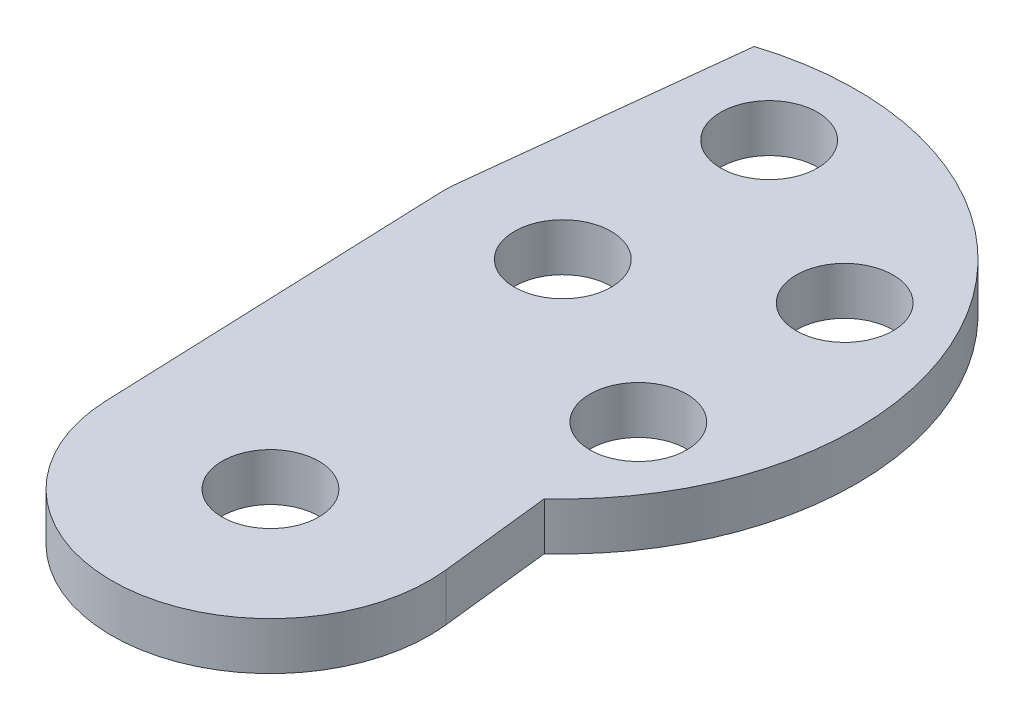
ISO-10303-21;
HEADER;
FILE_DESCRIPTION(('STEP AP214'),'2;1');
FILE_NAME('part.step','',(''),(''),'','','');
FILE_SCHEMA(('AUTOMOTIVE_DESIGN { 1 0 10303 214 1 1 1 1 }'));
ENDSEC;
DATA;
#1=APPLICATION_CONTEXT('core data for automotive mechanical design processes');
#2=APPLICATION_PROTOCOL_DEFINITION('international standard','automotive_design',2000,#1);
#3=PRODUCT_CONTEXT('',#1,'mechanical');
#4=PRODUCT('Part','Part','',(#3));
#5=PRODUCT_RELATED_PRODUCT_CATEGORY('part','',(#4));
#6=PRODUCT_DEFINITION_FORMATION('','',#4);
#7=PRODUCT_DEFINITION_CONTEXT('part definition',#1,'design');
#8=PRODUCT_DEFINITION('design','',#6,#7);
#9=PRODUCT_DEFINITION_SHAPE('','',#8);
#10=(LENGTH_UNIT() NAMED_UNIT(*) SI_UNIT(.MILLI.,.METRE.));
#11=(NAMED_UNIT(*) PLANE_ANGLE_UNIT() SI_UNIT($,.RADIAN.));
#12=(NAMED_UNIT(*) SI_UNIT($,.STERADIAN.) SOLID_ANGLE_UNIT());
#13=UNCERTAINTY_MEASURE_WITH_UNIT(LENGTH_MEASURE(1.E-05),#10,'distance_accuracy_value','');
#14=(GEOMETRIC_REPRESENTATION_CONTEXT(3) GLOBAL_UNCERTAINTY_ASSIGNED_CONTEXT((#13)) GLOBAL_UNIT_ASSIGNED_CONTEXT((#10,
#11,#12)) REPRESENTATION_CONTEXT('',''));
#15=CARTESIAN_POINT('',(0.,0.,0.));
#16=DIRECTION('',(0.,0.,1.));
#17=DIRECTION('',(1.,0.,0.));
#18=AXIS2_PLACEMENT_3D('',#15,#16,#17);
#19=CARTESIAN_POINT('',(0.,3.,0.));
#20=DIRECTION('',(0.,-1.,0.));
#21=DIRECTION('',(0.,0.,-1.));
#22=AXIS2_PLACEMENT_3D('',#19,#20,#21);
#23=CYLINDRICAL_SURFACE('',#22,7.5);
#24=DIRECTION('',(0.,1.,0.));
#25=VECTOR('',#24,1.);
#26=CARTESIAN_POINT('',(-7.4945582104402,0.,0.285652289196968));
#27=LINE('',#26,#25);
#28=CARTESIAN_POINT('',(-7.49455821044019,0.,0.285652289196968));
#29=VERTEX_POINT('',#28);
#30=CARTESIAN_POINT('',(-7.49455821044019,3.,0.285652289196968));
#31=VERTEX_POINT('',#30);
#32=EDGE_CURVE('E66',#29,#31,#27,.T.);
#33=ORIENTED_EDGE('',*,*,#32,.T.);
#34=CARTESIAN_POINT('',(0.,3.,0.));
#35=DIRECTION('',(0.,1.,0.));
#36=DIRECTION('',(0.,0.,1.));
#37=AXIS2_PLACEMENT_3D('',#34,#35,#36);
#38=CIRCLE('',#37,7.5);
#39=CARTESIAN_POINT('',(-7.45384122730723,3.,-0.830813431580786));
#40=VERTEX_POINT('',#39);
#41=EDGE_CURVE('E160',#40,#31,#38,.T.);
#42=ORIENTED_EDGE('',*,*,#41,.F.);
#43=DIRECTION('',(0.,-1.,0.));
#44=VECTOR('',#43,1.);
#45=CARTESIAN_POINT('',(-7.45384122730723,3.,-0.830813431580786));
#46=LINE('',#45,#44);
#47=CARTESIAN_POINT('',(-7.45384122730723,0.,-0.830813431580786));
#48=VERTEX_POINT('',#47);
#49=EDGE_CURVE('E182',#40,#48,#46,.T.);
#50=ORIENTED_EDGE('',*,*,#49,.T.);
#51=CARTESIAN_POINT('',(0.,0.,0.));
#52=DIRECTION('',(0.,1.,0.));
#53=DIRECTION('',(0.,0.,1.));
#54=AXIS2_PLACEMENT_3D('',#51,#52,#53);
#55=CIRCLE('',#54,7.5);
#56=EDGE_CURVE('E71',#48,#29,#55,.T.);
#57=ORIENTED_EDGE('',*,*,#56,.T.);
#58=EDGE_LOOP('',(#33,#42,#50,#57));
#59=FACE_BOUND('',#58,.T.);
#60=ADVANCED_FACE('F51',(#59),#23,.T.);
#61=CARTESIAN_POINT('',(0.,3.,0.));
#62=DIRECTION('',(0.,-1.,0.));
#63=DIRECTION('',(0.,0.,-1.));
#64=AXIS2_PLACEMENT_3D('',#61,#62,#63);
#65=CYLINDRICAL_SURFACE('',#64,18.5);
#66=CARTESIAN_POINT('',(0.,0.,0.));
#67=DIRECTION('',(0.,1.,0.));
#68=DIRECTION('',(0.,0.,1.));
#69=AXIS2_PLACEMENT_3D('',#66,#67,#68);
#70=CIRCLE('',#69,18.5);
#71=CARTESIAN_POINT('',(12.4849543742246,0.,13.6519564265906));
#72=VERTEX_POINT('',#71);
#73=CARTESIAN_POINT('',(-5.58046388967373,0.,-17.6382658664634));
#74=VERTEX_POINT('',#73);
#75=EDGE_CURVE('E185',#72,#74,#70,.T.);
#76=ORIENTED_EDGE('',*,*,#75,.T.);
#77=DIRECTION('',(0.,-1.,0.));
#78=VECTOR('',#77,1.);
#79=CARTESIAN_POINT('',(-5.58046388967373,3.,-17.6382658664634));
#80=LINE('',#79,#78);
#81=CARTESIAN_POINT('',(-5.58046388967373,3.,-17.6382658664634));
#82=VERTEX_POINT('',#81);
#83=EDGE_CURVE('E59',#82,#74,#80,.T.);
#84=ORIENTED_EDGE('',*,*,#83,.F.);
#85=CARTESIAN_POINT('',(0.,3.,0.));
#86=DIRECTION('',(0.,1.,0.));
#87=DIRECTION('',(0.,0.,1.));
#88=AXIS2_PLACEMENT_3D('',#85,#86,#87);
#89=CIRCLE('',#88,18.5);
#90=CARTESIAN_POINT('',(12.4849543742246,3.,13.6519564265906));
#91=VERTEX_POINT('',#90);
#92=EDGE_CURVE('E163',#91,#82,#89,.T.);
#93=ORIENTED_EDGE('',*,*,#92,.F.);
#94=DIRECTION('',(0.,-1.,0.));
#95=VECTOR('',#94,1.);
#96=CARTESIAN_POINT('',(12.4849543742246,3.,13.6519564265906));
#97=LINE('',#96,#95);
#98=EDGE_CURVE('E11',#91,#72,#97,.T.);
#99=ORIENTED_EDGE('',*,*,#98,.T.);
#100=EDGE_LOOP('',(#76,#84,#93,#99));
#101=FACE_BOUND('',#100,.T.);
#102=ADVANCED_FACE('F213',(#101),#65,.T.);
#103=CARTESIAN_POINT('',(11.2583302491977,3.,6.49999999999997));
#104=DIRECTION('',(0.,-1.,0.));
#105=DIRECTION('',(0.,0.,-1.));
#106=AXIS2_PLACEMENT_3D('',#103,#104,#105);
#107=CYLINDRICAL_SURFACE('',#106,3.05);
#108=CARTESIAN_POINT('',(11.2583302491977,3.,6.49999999999997));
#109=DIRECTION('',(0.,1.,0.));
#110=DIRECTION('',(0.,0.,1.));
#111=AXIS2_PLACEMENT_3D('',#108,#109,#110);
#112=CIRCLE('',#111,3.05);
#113=CARTESIAN_POINT('',(11.2583302491977,3.,9.54999999999997));
#114=VERTEX_POINT('',#113);
#115=EDGE_CURVE('E174',#114,#114,#112,.T.);
#116=ORIENTED_EDGE('',*,*,#115,.T.);
#117=EDGE_LOOP('',(#116));
#118=FACE_BOUND('',#117,.T.);
#119=CARTESIAN_POINT('',(11.2583302491977,0.,6.49999999999997));
#120=DIRECTION('',(0.,1.,0.));
#121=DIRECTION('',(0.,0.,1.));
#122=AXIS2_PLACEMENT_3D('',#119,#120,#121);
#123=CIRCLE('',#122,3.05);
#124=CARTESIAN_POINT('',(11.2583302491977,0.,9.54999999999997));
#125=VERTEX_POINT('',#124);
#126=EDGE_CURVE('E194',#125,#125,#123,.T.);
#127=ORIENTED_EDGE('',*,*,#126,.F.);
#128=EDGE_LOOP('',(#127));
#129=FACE_BOUND('',#128,.T.);
#130=ADVANCED_FACE('F223',(#118,#129),#107,.F.);
#131=CARTESIAN_POINT('',(0.,3.,-13.));
#132=DIRECTION('',(0.,-1.,0.));
#133=DIRECTION('',(0.,0.,-1.));
#134=AXIS2_PLACEMENT_3D('',#131,#132,#133);
#135=CYLINDRICAL_SURFACE('',#134,3.05);
#136=CARTESIAN_POINT('',(0.,3.,-13.));
#137=DIRECTION('',(0.,1.,0.));
#138=DIRECTION('',(0.,0.,1.));
#139=AXIS2_PLACEMENT_3D('',#136,#137,#138);
#140=CIRCLE('',#139,3.05);
#141=CARTESIAN_POINT('',(0.,3.,-9.95));
#142=VERTEX_POINT('',#141);
#143=EDGE_CURVE('E170',#142,#142,#140,.T.);
#144=ORIENTED_EDGE('',*,*,#143,.T.);
#145=EDGE_LOOP('',(#144));
#146=FACE_BOUND('',#145,.T.);
#147=CARTESIAN_POINT('',(0.,0.,-13.));
#148=DIRECTION('',(0.,1.,0.));
#149=DIRECTION('',(0.,0.,1.));
#150=AXIS2_PLACEMENT_3D('',#147,#148,#149);
#151=CIRCLE('',#150,3.05);
#152=CARTESIAN_POINT('',(0.,0.,-9.95));
#153=VERTEX_POINT('',#152);
#154=EDGE_CURVE('E190',#153,#153,#151,.T.);
#155=ORIENTED_EDGE('',*,*,#154,.F.);
#156=EDGE_LOOP('',(#155));
#157=FACE_BOUND('',#156,.T.);
#158=ADVANCED_FACE('F226',(#146,#157),#135,.F.);
#159=CARTESIAN_POINT('',(-7.45384122730723,3.,-0.830813431580786));
#160=DIRECTION('',(0.993845496974297,0.,0.110775124210771));
#161=DIRECTION('',(0.110775124210771,0.,-0.993845496974297));
#162=AXIS2_PLACEMENT_3D('',#159,#160,#161);
#163=PLANE('',#162);
#164=DIRECTION('',(-0.110775124210771,0.,0.993845496974297));
#165=VECTOR('',#164,1.);
#166=CARTESIAN_POINT('',(-7.45384122730723,0.,-0.830813431580786));
#167=LINE('',#166,#165);
#168=EDGE_CURVE('E187',#74,#48,#167,.T.);
#169=ORIENTED_EDGE('',*,*,#168,.T.);
#170=ORIENTED_EDGE('',*,*,#49,.F.);
#171=DIRECTION('',(-0.110775124210771,0.,0.993845496974297));
#172=VECTOR('',#171,1.);
#173=CARTESIAN_POINT('',(-7.45384122730723,3.,-0.830813431580786));
#174=LINE('',#173,#172);
#175=EDGE_CURVE('E167',#82,#40,#174,.T.);
#176=ORIENTED_EDGE('',*,*,#175,.F.);
#177=ORIENTED_EDGE('',*,*,#83,.T.);
#178=EDGE_LOOP('',(#169,#170,#176,#177));
#179=FACE_BOUND('',#178,.T.);
#180=ADVANCED_FACE('F209',(#179),#163,.F.);
#181=CARTESIAN_POINT('',(11.2583302491977,3.,-6.50000000000005));
#182=DIRECTION('',(0.,-1.,0.));
#183=DIRECTION('',(0.,0.,-1.));
#184=AXIS2_PLACEMENT_3D('',#181,#182,#183);
#185=CYLINDRICAL_SURFACE('',#184,3.05);
#186=CARTESIAN_POINT('',(11.2583302491977,3.,-6.50000000000005));
#187=DIRECTION('',(0.,1.,0.));
#188=DIRECTION('',(0.,0.,1.));
#189=AXIS2_PLACEMENT_3D('',#186,#187,#188);
#190=CIRCLE('',#189,3.05);
#191=CARTESIAN_POINT('',(11.2583302491977,3.,-3.45000000000005));
#192=VERTEX_POINT('',#191);
#193=EDGE_CURVE('E178',#192,#192,#190,.T.);
#194=ORIENTED_EDGE('',*,*,#193,.T.);
#195=EDGE_LOOP('',(#194));
#196=FACE_BOUND('',#195,.T.);
#197=CARTESIAN_POINT('',(11.2583302491977,0.,-6.50000000000005));
#198=DIRECTION('',(0.,1.,0.));
#199=DIRECTION('',(0.,0.,1.));
#200=AXIS2_PLACEMENT_3D('',#197,#198,#199);
#201=CIRCLE('',#200,3.05);
#202=CARTESIAN_POINT('',(11.2583302491977,0.,-3.45000000000005));
#203=VERTEX_POINT('',#202);
#204=EDGE_CURVE('E164',#203,#203,#201,.T.);
#205=ORIENTED_EDGE('',*,*,#204,.F.);
#206=EDGE_LOOP('',(#205));
#207=FACE_BOUND('',#206,.T.);
#208=ADVANCED_FACE('F232',(#196,#207),#185,.F.);
#209=CARTESIAN_POINT('',(0.,3.,0.));
#210=DIRECTION('',(0.,1.,0.));
#211=DIRECTION('',(0.,0.,1.));
#212=AXIS2_PLACEMENT_3D('',#209,#210,#211);
#213=PLANE('',#212);
#214=CARTESIAN_POINT('',(0.,3.,0.));
#215=DIRECTION('',(0.,1.,0.));
#216=DIRECTION('',(0.,0.,1.));
#217=AXIS2_PLACEMENT_3D('',#214,#215,#216);
#218=CIRCLE('',#217,3.05);
#219=CARTESIAN_POINT('',(0.,3.,3.05));
#220=VERTEX_POINT('',#219);
#221=EDGE_CURVE('E140',#220,#220,#218,.T.);
#222=ORIENTED_EDGE('',*,*,#221,.F.);
#223=EDGE_LOOP('',(#222));
#224=FACE_BOUND('',#223,.T.);
#225=ORIENTED_EDGE('',*,*,#41,.T.);
#226=DIRECTION('',(0.038086971892929,0.,0.999274428058693));
#227=VECTOR('',#226,1.);
#228=CARTESIAN_POINT('',(-7.4945582104402,3.,0.285652289196968));
#229=LINE('',#228,#227);
#230=CARTESIAN_POINT('',(-6.6620724891128,3.,22.1272860999673));
#231=VERTEX_POINT('',#230);
#232=EDGE_CURVE('E148',#31,#231,#229,.T.);
#233=ORIENTED_EDGE('',*,*,#232,.T.);
#234=CARTESIAN_POINT('',(3.33067179147412,3.,21.746416381038));
#235=DIRECTION('',(0.,1.,0.));
#236=DIRECTION('',(0.,0.,1.));
#237=AXIS2_PLACEMENT_3D('',#234,#235,#236);
#238=CIRCLE('',#237,10.);
#239=CARTESIAN_POINT('',(13.2682736910461,3.,20.6310382004987));
#240=VERTEX_POINT('',#239);
#241=EDGE_CURVE('E109',#231,#240,#238,.T.);
#242=ORIENTED_EDGE('',*,*,#241,.T.);
#243=DIRECTION('',(0.111537818053933,0.,0.993760189957199));
#244=VECTOR('',#243,1.);
#245=CARTESIAN_POINT('',(10.8164249770272,3.,-1.21401566824047));
#246=LINE('',#245,#244);
#247=EDGE_CURVE('E137',#91,#240,#246,.T.);
#248=ORIENTED_EDGE('',*,*,#247,.F.);
#249=ORIENTED_EDGE('',*,*,#92,.T.);
#250=ORIENTED_EDGE('',*,*,#175,.T.);
#251=EDGE_LOOP('',(#225,#233,#242,#248,#249,#250));
#252=FACE_BOUND('',#251,.T.);
#253=ORIENTED_EDGE('',*,*,#143,.F.);
#254=EDGE_LOOP('',(#253));
#255=FACE_BOUND('',#254,.T.);
#256=ORIENTED_EDGE('',*,*,#115,.F.);
#257=EDGE_LOOP('',(#256));
#258=FACE_BOUND('',#257,.T.);
#259=ORIENTED_EDGE('',*,*,#193,.F.);
#260=EDGE_LOOP('',(#259));
#261=FACE_BOUND('',#260,.T.);
#262=CARTESIAN_POINT('',(3.33067179147412,3.,21.746416381038));
#263=DIRECTION('',(0.,1.,0.));
#264=DIRECTION('',(0.,0.,1.));
#265=AXIS2_PLACEMENT_3D('',#262,#263,#264);
#266=CIRCLE('',#265,3.05);
#267=CARTESIAN_POINT('',(3.33067179147412,3.,24.796416381038));
#268=VERTEX_POINT('',#267);
#269=EDGE_CURVE('E130',#268,#268,#266,.T.);
#270=ORIENTED_EDGE('',*,*,#269,.F.);
#271=EDGE_LOOP('',(#270));
#272=FACE_BOUND('',#271,.T.);
#273=ADVANCED_FACE('F218',(#224,#252,#255,#258,#261,#272),#213,.T.);
#274=CARTESIAN_POINT('',(0.,0.,0.));
#275=DIRECTION('',(0.,1.,0.));
#276=DIRECTION('',(0.,0.,1.));
#277=AXIS2_PLACEMENT_3D('',#274,#275,#276);
#278=PLANE('',#277);
#279=CARTESIAN_POINT('',(0.,0.,0.));
#280=DIRECTION('',(0.,1.,0.));
#281=DIRECTION('',(0.,0.,1.));
#282=AXIS2_PLACEMENT_3D('',#279,#280,#281);
#283=CIRCLE('',#282,3.05);
#284=CARTESIAN_POINT('',(0.,0.,3.05));
#285=VERTEX_POINT('',#284);
#286=EDGE_CURVE('E151',#285,#285,#283,.T.);
#287=ORIENTED_EDGE('',*,*,#286,.T.);
#288=EDGE_LOOP('',(#287));
#289=FACE_BOUND('',#288,.T.);
#290=ORIENTED_EDGE('',*,*,#56,.F.);
#291=ORIENTED_EDGE('',*,*,#168,.F.);
#292=ORIENTED_EDGE('',*,*,#75,.F.);
#293=DIRECTION('',(0.111537818053933,0.,0.993760189957199));
#294=VECTOR('',#293,1.);
#295=CARTESIAN_POINT('',(10.8164249770272,0.,-1.21401566824047));
#296=LINE('',#295,#294);
#297=CARTESIAN_POINT('',(13.2682736910461,0.,20.6310382004987));
#298=VERTEX_POINT('',#297);
#299=EDGE_CURVE('E124',#72,#298,#296,.T.);
#300=ORIENTED_EDGE('',*,*,#299,.T.);
#301=CARTESIAN_POINT('',(3.33067179147412,0.,21.746416381038));
#302=DIRECTION('',(0.,1.,0.));
#303=DIRECTION('',(0.,0.,1.));
#304=AXIS2_PLACEMENT_3D('',#301,#302,#303);
#305=CIRCLE('',#304,10.);
#306=CARTESIAN_POINT('',(-6.6620724891128,0.,22.1272860999673));
#307=VERTEX_POINT('',#306);
#308=EDGE_CURVE('E107',#307,#298,#305,.T.);
#309=ORIENTED_EDGE('',*,*,#308,.F.);
#310=DIRECTION('',(0.038086971892929,0.,0.999274428058693));
#311=VECTOR('',#310,1.);
#312=CARTESIAN_POINT('',(-7.4945582104402,0.,0.285652289196968));
#313=LINE('',#312,#311);
#314=EDGE_CURVE('E122',#29,#307,#313,.T.);
#315=ORIENTED_EDGE('',*,*,#314,.F.);
#316=EDGE_LOOP('',(#290,#291,#292,#300,#309,#315));
#317=FACE_BOUND('',#316,.T.);
#318=ORIENTED_EDGE('',*,*,#154,.T.);
#319=EDGE_LOOP('',(#318));
#320=FACE_BOUND('',#319,.T.);
#321=ORIENTED_EDGE('',*,*,#126,.T.);
#322=EDGE_LOOP('',(#321));
#323=FACE_BOUND('',#322,.T.);
#324=ORIENTED_EDGE('',*,*,#204,.T.);
#325=EDGE_LOOP('',(#324));
#326=FACE_BOUND('',#325,.T.);
#327=CARTESIAN_POINT('',(3.33067179147412,0.,21.746416381038));
#328=DIRECTION('',(0.,1.,0.));
#329=DIRECTION('',(0.,0.,1.));
#330=AXIS2_PLACEMENT_3D('',#327,#328,#329);
#331=CIRCLE('',#330,3.05);
#332=CARTESIAN_POINT('',(3.33067179147412,0.,24.796416381038));
#333=VERTEX_POINT('',#332);
#334=EDGE_CURVE('E116',#333,#333,#331,.T.);
#335=ORIENTED_EDGE('',*,*,#334,.T.);
#336=EDGE_LOOP('',(#335));
#337=FACE_BOUND('',#336,.T.);
#338=ADVANCED_FACE('F120',(#289,#317,#320,#323,#326,#337),#278,.F.);
#339=CARTESIAN_POINT('',(-7.4945582104402,0.,0.285652289196968));
#340=DIRECTION('',(-0.999274428058692,0.,0.038086971892929));
#341=DIRECTION('',(0.038086971892929,0.,0.999274428058693));
#342=AXIS2_PLACEMENT_3D('',#339,#340,#341);
#343=PLANE('',#342);
#344=ORIENTED_EDGE('',*,*,#232,.F.);
#345=ORIENTED_EDGE('',*,*,#32,.F.);
#346=ORIENTED_EDGE('',*,*,#314,.T.);
#347=DIRECTION('',(0.,1.,0.));
#348=VECTOR('',#347,1.);
#349=CARTESIAN_POINT('',(-6.6620724891128,0.,22.1272860999673));
#350=LINE('',#349,#348);
#351=EDGE_CURVE('E104',#307,#231,#350,.T.);
#352=ORIENTED_EDGE('',*,*,#351,.T.);
#353=EDGE_LOOP('',(#344,#345,#346,#352));
#354=FACE_BOUND('',#353,.T.);
#355=ADVANCED_FACE('F128',(#354),#343,.T.);
#356=CARTESIAN_POINT('',(10.8164249770272,0.,-1.21401566824047));
#357=DIRECTION('',(-0.993760189957199,0.,0.111537818053933));
#358=DIRECTION('',(0.111537818053933,0.,0.993760189957199));
#359=AXIS2_PLACEMENT_3D('',#356,#357,#358);
#360=PLANE('',#359);
#361=ORIENTED_EDGE('',*,*,#247,.T.);
#362=DIRECTION('',(0.,1.,0.));
#363=VECTOR('',#362,1.);
#364=CARTESIAN_POINT('',(13.2682736910461,0.,20.6310382004987));
#365=LINE('',#364,#363);
#366=EDGE_CURVE('E115',#298,#240,#365,.T.);
#367=ORIENTED_EDGE('',*,*,#366,.F.);
#368=ORIENTED_EDGE('',*,*,#299,.F.);
#369=ORIENTED_EDGE('',*,*,#98,.F.);
#370=EDGE_LOOP('',(#361,#367,#368,#369));
#371=FACE_BOUND('',#370,.T.);
#372=ADVANCED_FACE('F216',(#371),#360,.F.);
#373=CARTESIAN_POINT('',(3.33067179147412,0.,21.746416381038));
#374=DIRECTION('',(0.,1.,0.));
#375=DIRECTION('',(0.,0.,1.));
#376=AXIS2_PLACEMENT_3D('',#373,#374,#375);
#377=CYLINDRICAL_SURFACE('',#376,10.);
#378=ORIENTED_EDGE('',*,*,#241,.F.);
#379=ORIENTED_EDGE('',*,*,#351,.F.);
#380=ORIENTED_EDGE('',*,*,#308,.T.);
#381=ORIENTED_EDGE('',*,*,#366,.T.);
#382=EDGE_LOOP('',(#378,#379,#380,#381));
#383=FACE_BOUND('',#382,.T.);
#384=ADVANCED_FACE('F106',(#383),#377,.T.);
#385=CARTESIAN_POINT('',(3.33067179147412,0.,21.746416381038));
#386=DIRECTION('',(0.,1.,0.));
#387=DIRECTION('',(0.,0.,1.));
#388=AXIS2_PLACEMENT_3D('',#385,#386,#387);
#389=CYLINDRICAL_SURFACE('',#388,3.05);
#390=ORIENTED_EDGE('',*,*,#334,.F.);
#391=EDGE_LOOP('',(#390));
#392=FACE_BOUND('',#391,.T.);
#393=ORIENTED_EDGE('',*,*,#269,.T.);
#394=EDGE_LOOP('',(#393));
#395=FACE_BOUND('',#394,.T.);
#396=ADVANCED_FACE('F249',(#392,#395),#389,.F.);
#397=CARTESIAN_POINT('',(0.,0.,0.));
#398=DIRECTION('',(0.,1.,0.));
#399=DIRECTION('',(0.,0.,1.));
#400=AXIS2_PLACEMENT_3D('',#397,#398,#399);
#401=CYLINDRICAL_SURFACE('',#400,3.05);
#402=ORIENTED_EDGE('',*,*,#286,.F.);
#403=EDGE_LOOP('',(#402));
#404=FACE_BOUND('',#403,.T.);
#405=ORIENTED_EDGE('',*,*,#221,.T.);
#406=EDGE_LOOP('',(#405));
#407=FACE_BOUND('',#406,.T.);
#408=ADVANCED_FACE('F254',(#404,#407),#401,.F.);
#409=CLOSED_SHELL('',(#60,#102,#130,#158,#180,#208,#273,#338,#355,#372,#384,#396,#408));
#410=MANIFOLD_SOLID_BREP('B2',#409);
#411=ADVANCED_BREP_SHAPE_REPRESENTATION('',(#18,#410),#14);
#412=SHAPE_DEFINITION_REPRESENTATION(#9,#411);
ENDSEC;
END-ISO-10303-21;
